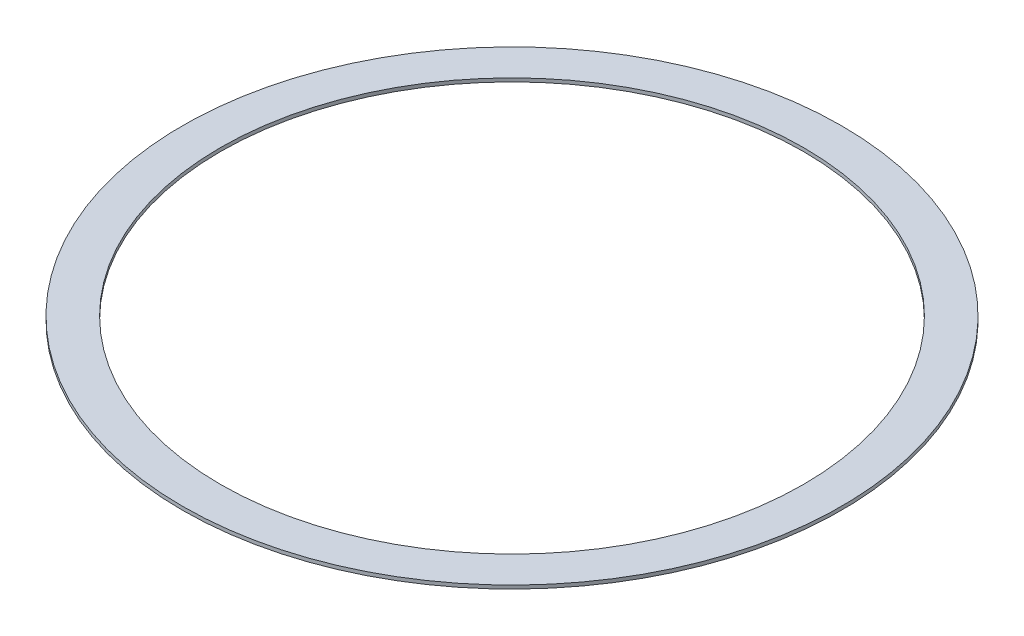
ISO-10303-21;
HEADER;
FILE_DESCRIPTION(('STEP AP214'),'2;1');
FILE_NAME('part.step','',(''),(''),'','','');
FILE_SCHEMA(('AUTOMOTIVE_DESIGN { 1 0 10303 214 1 1 1 1 }'));
ENDSEC;
DATA;
#1=APPLICATION_CONTEXT('core data for automotive mechanical design processes');
#2=APPLICATION_PROTOCOL_DEFINITION('international standard','automotive_design',2000,#1);
#3=PRODUCT_CONTEXT('',#1,'mechanical');
#4=PRODUCT('Part','Part','',(#3));
#5=PRODUCT_RELATED_PRODUCT_CATEGORY('part','',(#4));
#6=PRODUCT_DEFINITION_FORMATION('','',#4);
#7=PRODUCT_DEFINITION_CONTEXT('part definition',#1,'design');
#8=PRODUCT_DEFINITION('design','',#6,#7);
#9=PRODUCT_DEFINITION_SHAPE('','',#8);
#10=(LENGTH_UNIT() NAMED_UNIT(*) SI_UNIT(.MILLI.,.METRE.));
#11=(NAMED_UNIT(*) PLANE_ANGLE_UNIT() SI_UNIT($,.RADIAN.));
#12=(NAMED_UNIT(*) SI_UNIT($,.STERADIAN.) SOLID_ANGLE_UNIT());
#13=UNCERTAINTY_MEASURE_WITH_UNIT(LENGTH_MEASURE(1.E-05),#10,'distance_accuracy_value','');
#14=(GEOMETRIC_REPRESENTATION_CONTEXT(3) GLOBAL_UNCERTAINTY_ASSIGNED_CONTEXT((#13)) GLOBAL_UNIT_ASSIGNED_CONTEXT((#10,
#11,#12)) REPRESENTATION_CONTEXT('',''));
#15=CARTESIAN_POINT('',(0.,0.,0.));
#16=DIRECTION('',(0.,0.,1.));
#17=DIRECTION('',(1.,0.,0.));
#18=AXIS2_PLACEMENT_3D('',#15,#16,#17);
#19=CARTESIAN_POINT('',(0.,0.762,0.));
#20=DIRECTION('',(0.,1.,0.));
#21=DIRECTION('',(0.,0.,1.));
#22=AXIS2_PLACEMENT_3D('',#19,#20,#21);
#23=PLANE('',#22);
#24=CARTESIAN_POINT('',(0.,0.762,0.));
#25=DIRECTION('',(0.,1.,0.));
#26=DIRECTION('',(0.,0.,1.));
#27=AXIS2_PLACEMENT_3D('',#24,#25,#26);
#28=CIRCLE('',#27,71.755);
#29=CARTESIAN_POINT('',(0.,0.762,-71.755));
#30=VERTEX_POINT('',#29);
#31=EDGE_CURVE('E11',#30,#30,#28,.T.);
#32=ORIENTED_EDGE('',*,*,#31,.T.);
#33=EDGE_LOOP('',(#32));
#34=FACE_BOUND('',#33,.T.);
#35=CARTESIAN_POINT('',(0.,0.762,0.));
#36=DIRECTION('',(0.,1.,0.));
#37=DIRECTION('',(0.,0.,1.));
#38=AXIS2_PLACEMENT_3D('',#35,#36,#37);
#39=CIRCLE('',#38,63.5);
#40=CARTESIAN_POINT('',(0.,0.762,-63.5));
#41=VERTEX_POINT('',#40);
#42=EDGE_CURVE('E60',#41,#41,#39,.T.);
#43=ORIENTED_EDGE('',*,*,#42,.F.);
#44=EDGE_LOOP('',(#43));
#45=FACE_BOUND('',#44,.T.);
#46=ADVANCED_FACE('F47',(#34,#45),#23,.T.);
#47=CARTESIAN_POINT('',(0.,0.,0.));
#48=DIRECTION('',(0.,1.,0.));
#49=DIRECTION('',(0.,0.,1.));
#50=AXIS2_PLACEMENT_3D('',#47,#48,#49);
#51=PLANE('',#50);
#52=CARTESIAN_POINT('',(0.,0.,0.));
#53=DIRECTION('',(0.,1.,0.));
#54=DIRECTION('',(0.,0.,1.));
#55=AXIS2_PLACEMENT_3D('',#52,#53,#54);
#56=CIRCLE('',#55,71.755);
#57=CARTESIAN_POINT('',(0.,0.,-71.755));
#58=VERTEX_POINT('',#57);
#59=EDGE_CURVE('E51',#58,#58,#56,.T.);
#60=ORIENTED_EDGE('',*,*,#59,.F.);
#61=EDGE_LOOP('',(#60));
#62=FACE_BOUND('',#61,.T.);
#63=CARTESIAN_POINT('',(0.,0.,0.));
#64=DIRECTION('',(0.,1.,0.));
#65=DIRECTION('',(0.,0.,1.));
#66=AXIS2_PLACEMENT_3D('',#63,#64,#65);
#67=CIRCLE('',#66,63.5);
#68=CARTESIAN_POINT('',(0.,0.,-63.5));
#69=VERTEX_POINT('',#68);
#70=EDGE_CURVE('E62',#69,#69,#67,.T.);
#71=ORIENTED_EDGE('',*,*,#70,.T.);
#72=EDGE_LOOP('',(#71));
#73=FACE_BOUND('',#72,.T.);
#74=ADVANCED_FACE('F74',(#62,#73),#51,.F.);
#75=CARTESIAN_POINT('',(0.,0.762,0.));
#76=DIRECTION('',(0.,-1.,0.));
#77=DIRECTION('',(0.,0.,-1.));
#78=AXIS2_PLACEMENT_3D('',#75,#76,#77);
#79=CYLINDRICAL_SURFACE('',#78,71.755);
#80=CARTESIAN_POINT('',(0.,0.762,-71.755));
#81=CARTESIAN_POINT('',(0.,0.7540625,-71.755));
#82=CARTESIAN_POINT('',(0.,0.746125,-71.755));
#83=CARTESIAN_POINT('',(0.,0.73025,-71.755));
#84=CARTESIAN_POINT('',(0.,0.7223125,-71.755));
#85=CARTESIAN_POINT('',(0.,0.7064375,-71.755));
#86=CARTESIAN_POINT('',(0.,0.6985,-71.755));
#87=CARTESIAN_POINT('',(0.,0.682625,-71.755));
#88=CARTESIAN_POINT('',(0.,0.6746875,-71.755));
#89=CARTESIAN_POINT('',(0.,0.6588125,-71.755));
#90=CARTESIAN_POINT('',(0.,0.650875,-71.755));
#91=CARTESIAN_POINT('',(0.,0.635,-71.755));
#92=CARTESIAN_POINT('',(0.,0.6270625,-71.755));
#93=CARTESIAN_POINT('',(0.,0.6111875,-71.755));
#94=CARTESIAN_POINT('',(0.,0.60325,-71.755));
#95=CARTESIAN_POINT('',(0.,0.587375,-71.755));
#96=CARTESIAN_POINT('',(0.,0.5794375,-71.755));
#97=CARTESIAN_POINT('',(0.,0.5635625,-71.755));
#98=CARTESIAN_POINT('',(0.,0.555625,-71.755));
#99=CARTESIAN_POINT('',(0.,0.53975,-71.755));
#100=CARTESIAN_POINT('',(0.,0.5318125,-71.755));
#101=CARTESIAN_POINT('',(0.,0.5159375,-71.755));
#102=CARTESIAN_POINT('',(0.,0.508,-71.755));
#103=CARTESIAN_POINT('',(0.,0.492125,-71.755));
#104=CARTESIAN_POINT('',(0.,0.4841875,-71.755));
#105=CARTESIAN_POINT('',(0.,0.4683125,-71.755));
#106=CARTESIAN_POINT('',(0.,0.460375,-71.755));
#107=CARTESIAN_POINT('',(0.,0.4445,-71.755));
#108=CARTESIAN_POINT('',(0.,0.4365625,-71.755));
#109=CARTESIAN_POINT('',(0.,0.4206875,-71.755));
#110=CARTESIAN_POINT('',(0.,0.41275,-71.755));
#111=CARTESIAN_POINT('',(0.,0.396875,-71.755));
#112=CARTESIAN_POINT('',(0.,0.3889375,-71.755));
#113=CARTESIAN_POINT('',(0.,0.3730625,-71.755));
#114=CARTESIAN_POINT('',(0.,0.365125,-71.755));
#115=CARTESIAN_POINT('',(0.,0.34925,-71.755));
#116=CARTESIAN_POINT('',(0.,0.3413125,-71.755));
#117=CARTESIAN_POINT('',(0.,0.3254375,-71.755));
#118=CARTESIAN_POINT('',(0.,0.3175,-71.755));
#119=CARTESIAN_POINT('',(0.,0.301625,-71.755));
#120=CARTESIAN_POINT('',(0.,0.2936875,-71.755));
#121=CARTESIAN_POINT('',(0.,0.2778125,-71.755));
#122=CARTESIAN_POINT('',(0.,0.269875,-71.755));
#123=CARTESIAN_POINT('',(0.,0.254,-71.755));
#124=CARTESIAN_POINT('',(0.,0.2460625,-71.755));
#125=CARTESIAN_POINT('',(0.,0.2301875,-71.755));
#126=CARTESIAN_POINT('',(0.,0.22225,-71.755));
#127=CARTESIAN_POINT('',(0.,0.206375,-71.755));
#128=CARTESIAN_POINT('',(0.,0.1984375,-71.755));
#129=CARTESIAN_POINT('',(0.,0.1825625,-71.755));
#130=CARTESIAN_POINT('',(0.,0.174625,-71.755));
#131=CARTESIAN_POINT('',(0.,0.15875,-71.755));
#132=CARTESIAN_POINT('',(0.,0.1508125,-71.755));
#133=CARTESIAN_POINT('',(0.,0.1349375,-71.755));
#134=CARTESIAN_POINT('',(0.,0.127,-71.755));
#135=CARTESIAN_POINT('',(0.,0.111125,-71.755));
#136=CARTESIAN_POINT('',(0.,0.1031875,-71.755));
#137=CARTESIAN_POINT('',(0.,0.0873125,-71.755));
#138=CARTESIAN_POINT('',(0.,0.079375,-71.755));
#139=CARTESIAN_POINT('',(0.,0.0635,-71.755));
#140=CARTESIAN_POINT('',(0.,0.0555625,-71.755));
#141=CARTESIAN_POINT('',(0.,0.0396875,-71.755));
#142=CARTESIAN_POINT('',(0.,0.03175,-71.755));
#143=CARTESIAN_POINT('',(0.,0.015875,-71.755));
#144=CARTESIAN_POINT('',(0.,0.00793749999999999,-71.755));
#145=CARTESIAN_POINT('',(0.,0.,-71.755));
#146=B_SPLINE_CURVE_WITH_KNOTS('',3,(#80,#81,#82,#83,#84,#85,#86,#87,#88,#89,#90,#91,#92,#93,
#94,#95,#96,#97,#98,#99,#100,#101,#102,#103,#104,#105,#106,#107,#108,#109,#110,#111,#112,#113,
#114,#115,#116,#117,#118,#119,#120,#121,#122,#123,#124,#125,#126,#127,#128,#129,#130,#131,#132,
#133,#134,#135,#136,#137,#138,#139,#140,#141,#142,#143,#144,#145),.UNSPECIFIED.,.F.,.F.,(4,2,2,
2,2,2,2,2,2,2,2,2,2,2,2,2,2,2,2,2,2,2,2,2,2,2,2,2,2,2,2,2,4),(0.,0.0238125,0.0476249999999999,
0.0714374999999999,0.09525,0.1190625,0.142875,0.1666875,0.1905,0.2143125,0.238125,0.2619375,
0.28575,0.3095625,0.333375,0.3571875,0.381,0.4048125,0.428625,0.4524375,0.47625,0.5000625,
0.523875,0.5476875,0.5715,0.5953125,0.619125,0.6429375,0.66675,0.6905625,0.714375,0.7381875,
0.762),.UNSPECIFIED.);
#147=EDGE_CURVE('BSEAM49',#30,#58,#146,.T.);
#148=ORIENTED_EDGE('',*,*,#31,.F.);
#149=ORIENTED_EDGE('',*,*,#59,.T.);
#150=ORIENTED_EDGE('',*,*,#147,.T.);
#151=ORIENTED_EDGE('',*,*,#147,.F.);
#152=EDGE_LOOP('',(#148,#150,#149,#151));
#153=FACE_BOUND('',#152,.T.);
#154=ADVANCED_FACE('F49',(#153),#79,.T.);
#155=CARTESIAN_POINT('',(0.,0.762,0.));
#156=DIRECTION('',(0.,-1.,0.));
#157=DIRECTION('',(0.,0.,-1.));
#158=AXIS2_PLACEMENT_3D('',#155,#156,#157);
#159=CYLINDRICAL_SURFACE('',#158,63.5);
#160=CARTESIAN_POINT('',(0.,0.762,-63.5));
#161=CARTESIAN_POINT('',(0.,0.7540625,-63.5));
#162=CARTESIAN_POINT('',(0.,0.746125,-63.5));
#163=CARTESIAN_POINT('',(0.,0.73025,-63.5));
#164=CARTESIAN_POINT('',(0.,0.7223125,-63.5));
#165=CARTESIAN_POINT('',(0.,0.7064375,-63.5));
#166=CARTESIAN_POINT('',(0.,0.6985,-63.5));
#167=CARTESIAN_POINT('',(0.,0.682625,-63.5));
#168=CARTESIAN_POINT('',(0.,0.6746875,-63.5));
#169=CARTESIAN_POINT('',(0.,0.6588125,-63.5));
#170=CARTESIAN_POINT('',(0.,0.650875,-63.5));
#171=CARTESIAN_POINT('',(0.,0.635,-63.5));
#172=CARTESIAN_POINT('',(0.,0.6270625,-63.5));
#173=CARTESIAN_POINT('',(0.,0.6111875,-63.5));
#174=CARTESIAN_POINT('',(0.,0.60325,-63.5));
#175=CARTESIAN_POINT('',(0.,0.587375,-63.5));
#176=CARTESIAN_POINT('',(0.,0.5794375,-63.5));
#177=CARTESIAN_POINT('',(0.,0.5635625,-63.5));
#178=CARTESIAN_POINT('',(0.,0.555625,-63.5));
#179=CARTESIAN_POINT('',(0.,0.53975,-63.5));
#180=CARTESIAN_POINT('',(0.,0.5318125,-63.5));
#181=CARTESIAN_POINT('',(0.,0.5159375,-63.5));
#182=CARTESIAN_POINT('',(0.,0.508,-63.5));
#183=CARTESIAN_POINT('',(0.,0.492125,-63.5));
#184=CARTESIAN_POINT('',(0.,0.4841875,-63.5));
#185=CARTESIAN_POINT('',(0.,0.4683125,-63.5));
#186=CARTESIAN_POINT('',(0.,0.460375,-63.5));
#187=CARTESIAN_POINT('',(0.,0.4445,-63.5));
#188=CARTESIAN_POINT('',(0.,0.4365625,-63.5));
#189=CARTESIAN_POINT('',(0.,0.4206875,-63.5));
#190=CARTESIAN_POINT('',(0.,0.41275,-63.5));
#191=CARTESIAN_POINT('',(0.,0.396875,-63.5));
#192=CARTESIAN_POINT('',(0.,0.3889375,-63.5));
#193=CARTESIAN_POINT('',(0.,0.3730625,-63.5));
#194=CARTESIAN_POINT('',(0.,0.365125,-63.5));
#195=CARTESIAN_POINT('',(0.,0.34925,-63.5));
#196=CARTESIAN_POINT('',(0.,0.3413125,-63.5));
#197=CARTESIAN_POINT('',(0.,0.3254375,-63.5));
#198=CARTESIAN_POINT('',(0.,0.3175,-63.5));
#199=CARTESIAN_POINT('',(0.,0.301625,-63.5));
#200=CARTESIAN_POINT('',(0.,0.2936875,-63.5));
#201=CARTESIAN_POINT('',(0.,0.2778125,-63.5));
#202=CARTESIAN_POINT('',(0.,0.269875,-63.5));
#203=CARTESIAN_POINT('',(0.,0.254,-63.5));
#204=CARTESIAN_POINT('',(0.,0.2460625,-63.5));
#205=CARTESIAN_POINT('',(0.,0.2301875,-63.5));
#206=CARTESIAN_POINT('',(0.,0.22225,-63.5));
#207=CARTESIAN_POINT('',(0.,0.206375,-63.5));
#208=CARTESIAN_POINT('',(0.,0.1984375,-63.5));
#209=CARTESIAN_POINT('',(0.,0.1825625,-63.5));
#210=CARTESIAN_POINT('',(0.,0.174625,-63.5));
#211=CARTESIAN_POINT('',(0.,0.15875,-63.5));
#212=CARTESIAN_POINT('',(0.,0.1508125,-63.5));
#213=CARTESIAN_POINT('',(0.,0.1349375,-63.5));
#214=CARTESIAN_POINT('',(0.,0.127,-63.5));
#215=CARTESIAN_POINT('',(0.,0.111125,-63.5));
#216=CARTESIAN_POINT('',(0.,0.1031875,-63.5));
#217=CARTESIAN_POINT('',(0.,0.0873125,-63.5));
#218=CARTESIAN_POINT('',(0.,0.079375,-63.5));
#219=CARTESIAN_POINT('',(0.,0.0635,-63.5));
#220=CARTESIAN_POINT('',(0.,0.0555625,-63.5));
#221=CARTESIAN_POINT('',(0.,0.0396875,-63.5));
#222=CARTESIAN_POINT('',(0.,0.03175,-63.5));
#223=CARTESIAN_POINT('',(0.,0.015875,-63.5));
#224=CARTESIAN_POINT('',(0.,0.00793749999999999,-63.5));
#225=CARTESIAN_POINT('',(0.,0.,-63.5));
#226=B_SPLINE_CURVE_WITH_KNOTS('',3,(#160,#161,#162,#163,#164,#165,#166,#167,#168,#169,#170,
#171,#172,#173,#174,#175,#176,#177,#178,#179,#180,#181,#182,#183,#184,#185,#186,#187,#188,#189,
#190,#191,#192,#193,#194,#195,#196,#197,#198,#199,#200,#201,#202,#203,#204,#205,#206,#207,#208,
#209,#210,#211,#212,#213,#214,#215,#216,#217,#218,#219,#220,#221,#222,#223,#224,#225),
.UNSPECIFIED.,.F.,.F.,(4,2,2,2,2,2,2,2,2,2,2,2,2,2,2,2,2,2,2,2,2,2,2,2,2,2,2,2,2,2,2,2,4),(0.,
0.0238125,0.0476249999999999,0.0714374999999999,0.09525,0.1190625,0.142875,0.1666875,0.1905,
0.2143125,0.238125,0.2619375,0.28575,0.3095625,0.333375,0.3571875,0.381,0.4048125,0.428625,
0.4524375,0.47625,0.5000625,0.523875,0.5476875,0.5715,0.5953125,0.619125,0.6429375,0.66675,
0.6905625,0.714375,0.7381875,0.762),.UNSPECIFIED.);
#227=EDGE_CURVE('BSEAM70',#41,#69,#226,.T.);
#228=ORIENTED_EDGE('',*,*,#42,.T.);
#229=ORIENTED_EDGE('',*,*,#70,.F.);
#230=ORIENTED_EDGE('',*,*,#227,.T.);
#231=ORIENTED_EDGE('',*,*,#227,.F.);
#232=EDGE_LOOP('',(#228,#230,#229,#231));
#233=FACE_BOUND('',#232,.T.);
#234=ADVANCED_FACE('F70',(#233),#159,.F.);
#235=CLOSED_SHELL('',(#46,#74,#154,#234));
#236=MANIFOLD_SOLID_BREP('B2',#235);
#237=ADVANCED_BREP_SHAPE_REPRESENTATION('',(#18,#236),#14);
#238=SHAPE_DEFINITION_REPRESENTATION(#9,#237);
ENDSEC;
END-ISO-10303-21;
